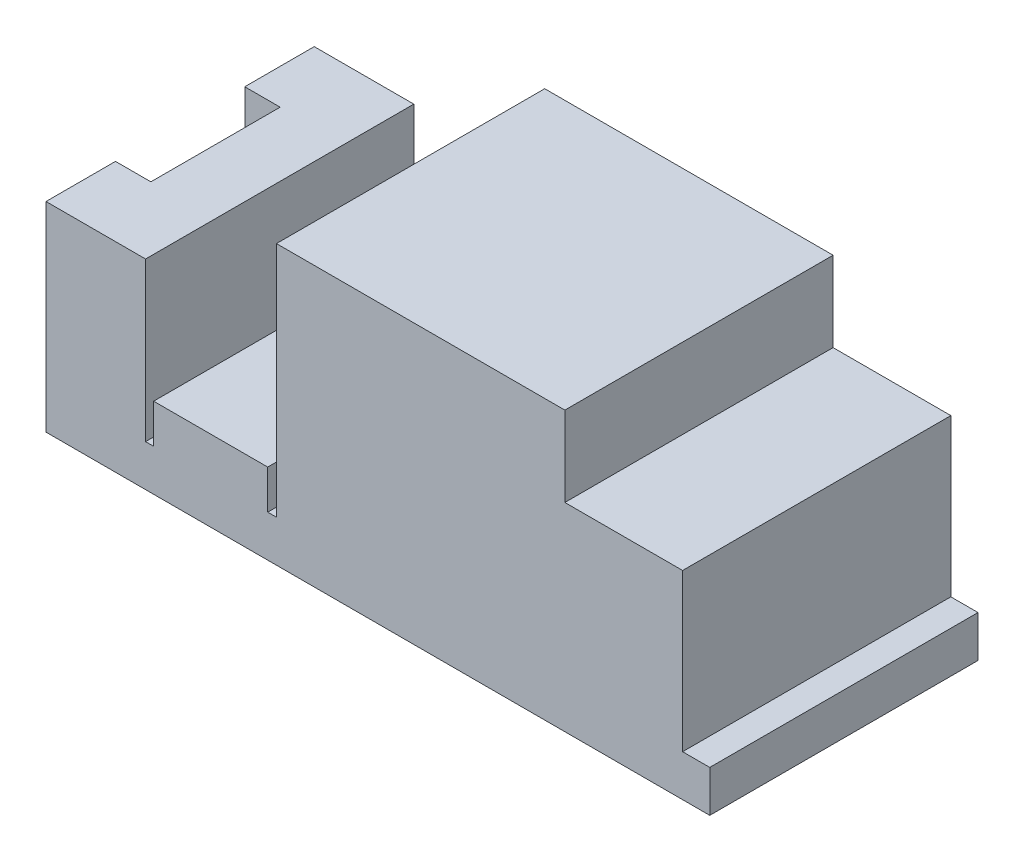
ISO-10303-21;
HEADER;
FILE_DESCRIPTION(('STEP AP214'),'2;1');
FILE_NAME('part.step','',(''),(''),'','','');
FILE_SCHEMA(('AUTOMOTIVE_DESIGN { 1 0 10303 214 1 1 1 1 }'));
ENDSEC;
DATA;
#1=APPLICATION_CONTEXT('core data for automotive mechanical design processes');
#2=APPLICATION_PROTOCOL_DEFINITION('international standard','automotive_design',2000,#1);
#3=PRODUCT_CONTEXT('',#1,'mechanical');
#4=PRODUCT('Part','Part','',(#3));
#5=PRODUCT_RELATED_PRODUCT_CATEGORY('part','',(#4));
#6=PRODUCT_DEFINITION_FORMATION('','',#4);
#7=PRODUCT_DEFINITION_CONTEXT('part definition',#1,'design');
#8=PRODUCT_DEFINITION('design','',#6,#7);
#9=PRODUCT_DEFINITION_SHAPE('','',#8);
#10=(LENGTH_UNIT() NAMED_UNIT(*) SI_UNIT(.MILLI.,.METRE.));
#11=(NAMED_UNIT(*) PLANE_ANGLE_UNIT() SI_UNIT($,.RADIAN.));
#12=(NAMED_UNIT(*) SI_UNIT($,.STERADIAN.) SOLID_ANGLE_UNIT());
#13=UNCERTAINTY_MEASURE_WITH_UNIT(LENGTH_MEASURE(1.E-05),#10,'distance_accuracy_value','');
#14=(GEOMETRIC_REPRESENTATION_CONTEXT(3) GLOBAL_UNCERTAINTY_ASSIGNED_CONTEXT((#13)) GLOBAL_UNIT_ASSIGNED_CONTEXT((#10,
#11,#12)) REPRESENTATION_CONTEXT('',''));
#15=CARTESIAN_POINT('',(0.,0.,0.));
#16=DIRECTION('',(0.,0.,1.));
#17=DIRECTION('',(1.,0.,0.));
#18=AXIS2_PLACEMENT_3D('',#15,#16,#17);
#19=CARTESIAN_POINT('',(0.,0.,0.));
#20=DIRECTION('',(0.,1.,0.));
#21=DIRECTION('',(0.,0.,1.));
#22=AXIS2_PLACEMENT_3D('',#19,#20,#21);
#23=PLANE('',#22);
#24=DIRECTION('',(1.,0.,0.));
#25=VECTOR('',#24,1.);
#26=CARTESIAN_POINT('',(-21.565,0.,8.715));
#27=LINE('',#26,#25);
#28=CARTESIAN_POINT('',(-15.095,0.,8.715));
#29=VERTEX_POINT('',#28);
#30=CARTESIAN_POINT('',(-14.5701718055896,0.,8.715));
#31=VERTEX_POINT('',#30);
#32=EDGE_CURVE('E336',#29,#31,#27,.T.);
#33=ORIENTED_EDGE('',*,*,#32,.T.);
#34=DIRECTION('',(0.,0.,1.));
#35=VECTOR('',#34,1.);
#36=CARTESIAN_POINT('',(-14.5701718055896,0.,-8.715));
#37=LINE('',#36,#35);
#38=CARTESIAN_POINT('',(-14.5701718055896,0.,-8.715));
#39=VERTEX_POINT('',#38);
#40=EDGE_CURVE('E228',#39,#31,#37,.T.);
#41=ORIENTED_EDGE('',*,*,#40,.F.);
#42=DIRECTION('',(-1.,0.,0.));
#43=VECTOR('',#42,1.);
#44=CARTESIAN_POINT('',(-21.565,0.,-8.715));
#45=LINE('',#44,#43);
#46=CARTESIAN_POINT('',(-15.095,0.,-8.715));
#47=VERTEX_POINT('',#46);
#48=EDGE_CURVE('E351',#39,#47,#45,.T.);
#49=ORIENTED_EDGE('',*,*,#48,.T.);
#50=DIRECTION('',(0.,0.,-1.));
#51=VECTOR('',#50,1.);
#52=CARTESIAN_POINT('',(-15.095,0.,-8.715));
#53=LINE('',#52,#51);
#54=EDGE_CURVE('E306',#29,#47,#53,.T.);
#55=ORIENTED_EDGE('',*,*,#54,.F.);
#56=EDGE_LOOP('',(#33,#41,#49,#55));
#57=FACE_BOUND('',#56,.T.);
#58=ADVANCED_FACE('F40',(#57),#23,.T.);
#59=CARTESIAN_POINT('',(-6.58978752544258,0.,-8.715));
#60=VERTEX_POINT('',#59);
#61=CARTESIAN_POINT('',(-7.15904635430355,0.,-8.715));
#62=VERTEX_POINT('',#61);
#63=EDGE_CURVE('E356',#60,#62,#45,.T.);
#64=ORIENTED_EDGE('',*,*,#63,.T.);
#65=DIRECTION('',(0.,0.,-1.));
#66=VECTOR('',#65,1.);
#67=CARTESIAN_POINT('',(-7.15904635430355,0.,-8.715));
#68=LINE('',#67,#66);
#69=CARTESIAN_POINT('',(-7.15904635430355,0.,8.715));
#70=VERTEX_POINT('',#69);
#71=EDGE_CURVE('E66',#70,#62,#68,.T.);
#72=ORIENTED_EDGE('',*,*,#71,.F.);
#73=CARTESIAN_POINT('',(-6.58978752544258,0.,8.715));
#74=VERTEX_POINT('',#73);
#75=EDGE_CURVE('E358',#70,#74,#27,.T.);
#76=ORIENTED_EDGE('',*,*,#75,.T.);
#77=DIRECTION('',(0.,0.,1.));
#78=VECTOR('',#77,1.);
#79=CARTESIAN_POINT('',(-6.58978752544258,0.,-8.715));
#80=LINE('',#79,#78);
#81=EDGE_CURVE('E249',#60,#74,#80,.T.);
#82=ORIENTED_EDGE('',*,*,#81,.F.);
#83=EDGE_LOOP('',(#64,#72,#76,#82));
#84=FACE_BOUND('',#83,.T.);
#85=ADVANCED_FACE('F450',(#84),#23,.T.);
#86=CARTESIAN_POINT('',(21.565,-2.7,-8.715));
#87=DIRECTION('',(1.,0.,0.));
#88=DIRECTION('',(0.,0.,-1.));
#89=AXIS2_PLACEMENT_3D('',#86,#87,#88);
#90=PLANE('',#89);
#91=DIRECTION('',(0.,0.,-1.));
#92=VECTOR('',#91,1.);
#93=CARTESIAN_POINT('',(21.565,0.,-8.715));
#94=LINE('',#93,#92);
#95=CARTESIAN_POINT('',(21.565,0.,8.715));
#96=VERTEX_POINT('',#95);
#97=CARTESIAN_POINT('',(21.565,0.,-8.715));
#98=VERTEX_POINT('',#97);
#99=EDGE_CURVE('E330',#96,#98,#94,.T.);
#100=ORIENTED_EDGE('',*,*,#99,.F.);
#101=DIRECTION('',(0.,1.,0.));
#102=VECTOR('',#101,1.);
#103=CARTESIAN_POINT('',(21.565,-2.7,8.715));
#104=LINE('',#103,#102);
#105=CARTESIAN_POINT('',(21.565,-2.7,8.715));
#106=VERTEX_POINT('',#105);
#107=EDGE_CURVE('E11',#106,#96,#104,.T.);
#108=ORIENTED_EDGE('',*,*,#107,.F.);
#109=DIRECTION('',(0.,0.,-1.));
#110=VECTOR('',#109,1.);
#111=CARTESIAN_POINT('',(21.565,-2.7,-8.715));
#112=LINE('',#111,#110);
#113=CARTESIAN_POINT('',(21.565,-2.7,-8.715));
#114=VERTEX_POINT('',#113);
#115=EDGE_CURVE('E331',#106,#114,#112,.T.);
#116=ORIENTED_EDGE('',*,*,#115,.T.);
#117=DIRECTION('',(0.,1.,0.));
#118=VECTOR('',#117,1.);
#119=CARTESIAN_POINT('',(21.565,-2.7,-8.715));
#120=LINE('',#119,#118);
#121=EDGE_CURVE('E44',#114,#98,#120,.T.);
#122=ORIENTED_EDGE('',*,*,#121,.T.);
#123=EDGE_LOOP('',(#100,#108,#116,#122));
#124=FACE_BOUND('',#123,.T.);
#125=ADVANCED_FACE('F42',(#124),#90,.T.);
#126=CARTESIAN_POINT('',(-21.565,-2.7,8.715));
#127=DIRECTION('',(0.,0.,1.));
#128=DIRECTION('',(1.,0.,0.));
#129=AXIS2_PLACEMENT_3D('',#126,#127,#128);
#130=PLANE('',#129);
#131=ORIENTED_EDGE('',*,*,#32,.F.);
#132=DIRECTION('',(0.,-1.,0.));
#133=VECTOR('',#132,1.);
#134=CARTESIAN_POINT('',(-15.095,10.28,8.715));
#135=LINE('',#134,#133);
#136=CARTESIAN_POINT('',(-15.095,10.28,8.715));
#137=VERTEX_POINT('',#136);
#138=EDGE_CURVE('E326',#137,#29,#135,.T.);
#139=ORIENTED_EDGE('',*,*,#138,.F.);
#140=DIRECTION('',(1.,0.,0.));
#141=VECTOR('',#140,1.);
#142=CARTESIAN_POINT('',(-21.565,10.28,8.715));
#143=LINE('',#142,#141);
#144=CARTESIAN_POINT('',(-21.565,10.28,8.715));
#145=VERTEX_POINT('',#144);
#146=EDGE_CURVE('E313',#145,#137,#143,.T.);
#147=ORIENTED_EDGE('',*,*,#146,.F.);
#148=DIRECTION('',(0.,1.,0.));
#149=VECTOR('',#148,1.);
#150=CARTESIAN_POINT('',(-21.565,-2.7,8.715));
#151=LINE('',#150,#149);
#152=CARTESIAN_POINT('',(-21.565,-2.7,8.715));
#153=VERTEX_POINT('',#152);
#154=EDGE_CURVE('E50',#153,#145,#151,.T.);
#155=ORIENTED_EDGE('',*,*,#154,.F.);
#156=DIRECTION('',(1.,0.,0.));
#157=VECTOR('',#156,1.);
#158=CARTESIAN_POINT('',(-21.565,-2.7,8.715));
#159=LINE('',#158,#157);
#160=EDGE_CURVE('E344',#153,#106,#159,.T.);
#161=ORIENTED_EDGE('',*,*,#160,.T.);
#162=ORIENTED_EDGE('',*,*,#107,.T.);
#163=CARTESIAN_POINT('',(19.8002124745574,0.,8.715));
#164=VERTEX_POINT('',#163);
#165=EDGE_CURVE('E355',#164,#96,#27,.T.);
#166=ORIENTED_EDGE('',*,*,#165,.F.);
#167=DIRECTION('',(0.,-1.,0.));
#168=VECTOR('',#167,1.);
#169=CARTESIAN_POINT('',(19.8002124745574,10.2,8.715));
#170=LINE('',#169,#168);
#171=CARTESIAN_POINT('',(19.8002124745574,10.2,8.715));
#172=VERTEX_POINT('',#171);
#173=EDGE_CURVE('E302',#172,#164,#170,.T.);
#174=ORIENTED_EDGE('',*,*,#173,.F.);
#175=DIRECTION('',(1.,0.,0.));
#176=VECTOR('',#175,1.);
#177=CARTESIAN_POINT('',(0.,10.2,8.715));
#178=LINE('',#177,#176);
#179=CARTESIAN_POINT('',(12.1502124745574,10.2,8.715));
#180=VERTEX_POINT('',#179);
#181=EDGE_CURVE('E289',#180,#172,#178,.T.);
#182=ORIENTED_EDGE('',*,*,#181,.F.);
#183=DIRECTION('',(0.,-1.,0.));
#184=VECTOR('',#183,1.);
#185=CARTESIAN_POINT('',(12.1502124745574,15.4,8.715));
#186=LINE('',#185,#184);
#187=CARTESIAN_POINT('',(12.1502124745574,15.4,8.715));
#188=VERTEX_POINT('',#187);
#189=EDGE_CURVE('E270',#188,#180,#186,.T.);
#190=ORIENTED_EDGE('',*,*,#189,.F.);
#191=DIRECTION('',(1.,0.,0.));
#192=VECTOR('',#191,1.);
#193=CARTESIAN_POINT('',(12.1502124745574,15.4,8.715));
#194=LINE('',#193,#192);
#195=CARTESIAN_POINT('',(-6.58978752544258,15.4,8.715));
#196=VERTEX_POINT('',#195);
#197=EDGE_CURVE('E257',#196,#188,#194,.T.);
#198=ORIENTED_EDGE('',*,*,#197,.F.);
#199=DIRECTION('',(0.,-1.,0.));
#200=VECTOR('',#199,1.);
#201=CARTESIAN_POINT('',(-6.58978752544258,15.4,8.715));
#202=LINE('',#201,#200);
#203=EDGE_CURVE('E273',#196,#74,#202,.T.);
#204=ORIENTED_EDGE('',*,*,#203,.T.);
#205=ORIENTED_EDGE('',*,*,#75,.F.);
#206=DIRECTION('',(0.,-1.,0.));
#207=VECTOR('',#206,1.);
#208=CARTESIAN_POINT('',(-7.15904635430355,2.54,8.715));
#209=LINE('',#208,#207);
#210=CARTESIAN_POINT('',(-7.15904635430355,2.54,8.715));
#211=VERTEX_POINT('',#210);
#212=EDGE_CURVE('E237',#211,#70,#209,.T.);
#213=ORIENTED_EDGE('',*,*,#212,.F.);
#214=DIRECTION('',(1.,0.,0.));
#215=VECTOR('',#214,1.);
#216=CARTESIAN_POINT('',(-14.5701718055896,2.54,8.715));
#217=LINE('',#216,#215);
#218=CARTESIAN_POINT('',(-14.5701718055896,2.54,8.715));
#219=VERTEX_POINT('',#218);
#220=EDGE_CURVE('E221',#219,#211,#217,.T.);
#221=ORIENTED_EDGE('',*,*,#220,.F.);
#222=DIRECTION('',(0.,-1.,0.));
#223=VECTOR('',#222,1.);
#224=CARTESIAN_POINT('',(-14.5701718055896,2.54,8.715));
#225=LINE('',#224,#223);
#226=EDGE_CURVE('E241',#219,#31,#225,.T.);
#227=ORIENTED_EDGE('',*,*,#226,.T.);
#228=EDGE_LOOP('',(#131,#139,#147,#155,#161,#162,#166,#174,#182,#190,#198,#204,#205,#213,#221,#227));
#229=FACE_BOUND('',#228,.T.);
#230=ADVANCED_FACE('F383',(#229),#130,.T.);
#231=CARTESIAN_POINT('',(-21.565,-2.7,-8.715));
#232=DIRECTION('',(-1.,0.,0.));
#233=DIRECTION('',(0.,0.,1.));
#234=AXIS2_PLACEMENT_3D('',#231,#232,#233);
#235=PLANE('',#234);
#236=DIRECTION('',(0.,1.,0.));
#237=VECTOR('',#236,1.);
#238=CARTESIAN_POINT('',(-21.565,0.,4.2));
#239=LINE('',#238,#237);
#240=CARTESIAN_POINT('',(-21.565,0.,4.2));
#241=VERTEX_POINT('',#240);
#242=CARTESIAN_POINT('',(-21.565,10.28,4.2));
#243=VERTEX_POINT('',#242);
#244=EDGE_CURVE('E431',#241,#243,#239,.T.);
#245=ORIENTED_EDGE('',*,*,#244,.F.);
#246=DIRECTION('',(0.,0.,1.));
#247=VECTOR('',#246,1.);
#248=CARTESIAN_POINT('',(-21.565,0.,-4.2));
#249=LINE('',#248,#247);
#250=CARTESIAN_POINT('',(-21.565,0.,-4.2));
#251=VERTEX_POINT('',#250);
#252=EDGE_CURVE('E426',#251,#241,#249,.T.);
#253=ORIENTED_EDGE('',*,*,#252,.F.);
#254=DIRECTION('',(0.,-1.,0.));
#255=VECTOR('',#254,1.);
#256=CARTESIAN_POINT('',(-21.565,0.,-4.2));
#257=LINE('',#256,#255);
#258=CARTESIAN_POINT('',(-21.565,10.28,-4.2));
#259=VERTEX_POINT('',#258);
#260=EDGE_CURVE('E394',#259,#251,#257,.T.);
#261=ORIENTED_EDGE('',*,*,#260,.F.);
#262=DIRECTION('',(0.,0.,1.));
#263=VECTOR('',#262,1.);
#264=CARTESIAN_POINT('',(-21.565,10.28,-8.715));
#265=LINE('',#264,#263);
#266=CARTESIAN_POINT('',(-21.565,10.28,-8.715));
#267=VERTEX_POINT('',#266);
#268=EDGE_CURVE('E203',#267,#259,#265,.T.);
#269=ORIENTED_EDGE('',*,*,#268,.F.);
#270=DIRECTION('',(0.,1.,0.));
#271=VECTOR('',#270,1.);
#272=CARTESIAN_POINT('',(-21.565,-2.7,-8.715));
#273=LINE('',#272,#271);
#274=CARTESIAN_POINT('',(-21.565,-2.7,-8.715));
#275=VERTEX_POINT('',#274);
#276=EDGE_CURVE('E362',#275,#267,#273,.T.);
#277=ORIENTED_EDGE('',*,*,#276,.F.);
#278=DIRECTION('',(0.,0.,1.));
#279=VECTOR('',#278,1.);
#280=CARTESIAN_POINT('',(-21.565,-2.7,-8.715));
#281=LINE('',#280,#279);
#282=EDGE_CURVE('E340',#275,#153,#281,.T.);
#283=ORIENTED_EDGE('',*,*,#282,.T.);
#284=ORIENTED_EDGE('',*,*,#154,.T.);
#285=EDGE_CURVE('E310',#243,#145,#265,.T.);
#286=ORIENTED_EDGE('',*,*,#285,.F.);
#287=EDGE_LOOP('',(#245,#253,#261,#269,#277,#283,#284,#286));
#288=FACE_BOUND('',#287,.T.);
#289=ADVANCED_FACE('F390',(#288),#235,.T.);
#290=CARTESIAN_POINT('',(-21.565,-2.7,-8.715));
#291=DIRECTION('',(0.,0.,-1.));
#292=DIRECTION('',(-1.,0.,0.));
#293=AXIS2_PLACEMENT_3D('',#290,#291,#292);
#294=PLANE('',#293);
#295=ORIENTED_EDGE('',*,*,#63,.F.);
#296=DIRECTION('',(0.,-1.,0.));
#297=VECTOR('',#296,1.);
#298=CARTESIAN_POINT('',(-6.58978752544258,15.4,-8.715));
#299=LINE('',#298,#297);
#300=CARTESIAN_POINT('',(-6.58978752544258,15.4,-8.715));
#301=VERTEX_POINT('',#300);
#302=EDGE_CURVE('E277',#301,#60,#299,.T.);
#303=ORIENTED_EDGE('',*,*,#302,.F.);
#304=DIRECTION('',(-1.,0.,0.));
#305=VECTOR('',#304,1.);
#306=CARTESIAN_POINT('',(12.1502124745574,15.4,-8.715));
#307=LINE('',#306,#305);
#308=CARTESIAN_POINT('',(12.1502124745574,15.4,-8.715));
#309=VERTEX_POINT('',#308);
#310=EDGE_CURVE('E250',#309,#301,#307,.T.);
#311=ORIENTED_EDGE('',*,*,#310,.F.);
#312=DIRECTION('',(0.,-1.,0.));
#313=VECTOR('',#312,1.);
#314=CARTESIAN_POINT('',(12.1502124745574,15.4,-8.715));
#315=LINE('',#314,#313);
#316=CARTESIAN_POINT('',(12.1502124745574,10.2,-8.715));
#317=VERTEX_POINT('',#316);
#318=EDGE_CURVE('E263',#309,#317,#315,.T.);
#319=ORIENTED_EDGE('',*,*,#318,.T.);
#320=DIRECTION('',(-1.,0.,0.));
#321=VECTOR('',#320,1.);
#322=CARTESIAN_POINT('',(0.,10.2,-8.715));
#323=LINE('',#322,#321);
#324=CARTESIAN_POINT('',(19.8002124745574,10.2,-8.715));
#325=VERTEX_POINT('',#324);
#326=EDGE_CURVE('E281',#325,#317,#323,.T.);
#327=ORIENTED_EDGE('',*,*,#326,.F.);
#328=DIRECTION('',(0.,-1.,0.));
#329=VECTOR('',#328,1.);
#330=CARTESIAN_POINT('',(19.8002124745574,10.2,-8.715));
#331=LINE('',#330,#329);
#332=CARTESIAN_POINT('',(19.8002124745574,0.,-8.715));
#333=VERTEX_POINT('',#332);
#334=EDGE_CURVE('E296',#325,#333,#331,.T.);
#335=ORIENTED_EDGE('',*,*,#334,.T.);
#336=EDGE_CURVE('E352',#98,#333,#45,.T.);
#337=ORIENTED_EDGE('',*,*,#336,.F.);
#338=ORIENTED_EDGE('',*,*,#121,.F.);
#339=DIRECTION('',(-1.,0.,0.));
#340=VECTOR('',#339,1.);
#341=CARTESIAN_POINT('',(-21.565,-2.7,-8.715));
#342=LINE('',#341,#340);
#343=EDGE_CURVE('E335',#114,#275,#342,.T.);
#344=ORIENTED_EDGE('',*,*,#343,.T.);
#345=ORIENTED_EDGE('',*,*,#276,.T.);
#346=DIRECTION('',(-1.,0.,0.));
#347=VECTOR('',#346,1.);
#348=CARTESIAN_POINT('',(-21.565,10.28,-8.715));
#349=LINE('',#348,#347);
#350=CARTESIAN_POINT('',(-15.095,10.28,-8.715));
#351=VERTEX_POINT('',#350);
#352=EDGE_CURVE('E307',#351,#267,#349,.T.);
#353=ORIENTED_EDGE('',*,*,#352,.F.);
#354=DIRECTION('',(0.,-1.,0.));
#355=VECTOR('',#354,1.);
#356=CARTESIAN_POINT('',(-15.095,10.28,-8.715));
#357=LINE('',#356,#355);
#358=EDGE_CURVE('E319',#351,#47,#357,.T.);
#359=ORIENTED_EDGE('',*,*,#358,.T.);
#360=ORIENTED_EDGE('',*,*,#48,.F.);
#361=DIRECTION('',(0.,-1.,0.));
#362=VECTOR('',#361,1.);
#363=CARTESIAN_POINT('',(-14.5701718055896,2.54,-8.715));
#364=LINE('',#363,#362);
#365=CARTESIAN_POINT('',(-14.5701718055896,2.54,-8.715));
#366=VERTEX_POINT('',#365);
#367=EDGE_CURVE('E245',#366,#39,#364,.T.);
#368=ORIENTED_EDGE('',*,*,#367,.F.);
#369=DIRECTION('',(-1.,0.,0.));
#370=VECTOR('',#369,1.);
#371=CARTESIAN_POINT('',(-14.5701718055896,2.54,-8.715));
#372=LINE('',#371,#370);
#373=CARTESIAN_POINT('',(-7.15904635430355,2.54,-8.715));
#374=VERTEX_POINT('',#373);
#375=EDGE_CURVE('E214',#374,#366,#372,.T.);
#376=ORIENTED_EDGE('',*,*,#375,.F.);
#377=DIRECTION('',(0.,-1.,0.));
#378=VECTOR('',#377,1.);
#379=CARTESIAN_POINT('',(-7.15904635430355,2.54,-8.715));
#380=LINE('',#379,#378);
#381=EDGE_CURVE('E227',#374,#62,#380,.T.);
#382=ORIENTED_EDGE('',*,*,#381,.T.);
#383=EDGE_LOOP('',(#295,#303,#311,#319,#327,#335,#337,#338,#344,#345,#353,#359,#360,#368,#376,#382));
#384=FACE_BOUND('',#383,.T.);
#385=ADVANCED_FACE('F373',(#384),#294,.T.);
#386=CARTESIAN_POINT('',(0.,-2.7,0.));
#387=DIRECTION('',(0.,1.,0.));
#388=DIRECTION('',(0.,0.,1.));
#389=AXIS2_PLACEMENT_3D('',#386,#387,#388);
#390=PLANE('',#389);
#391=ORIENTED_EDGE('',*,*,#115,.F.);
#392=ORIENTED_EDGE('',*,*,#160,.F.);
#393=ORIENTED_EDGE('',*,*,#282,.F.);
#394=ORIENTED_EDGE('',*,*,#343,.F.);
#395=EDGE_LOOP('',(#391,#392,#393,#394));
#396=FACE_BOUND('',#395,.T.);
#397=ADVANCED_FACE('F386',(#396),#390,.F.);
#398=DIRECTION('',(0.,0.,1.));
#399=VECTOR('',#398,1.);
#400=CARTESIAN_POINT('',(19.8002124745574,0.,0.));
#401=LINE('',#400,#399);
#402=EDGE_CURVE('E280',#333,#164,#401,.T.);
#403=ORIENTED_EDGE('',*,*,#402,.T.);
#404=ORIENTED_EDGE('',*,*,#165,.T.);
#405=ORIENTED_EDGE('',*,*,#99,.T.);
#406=ORIENTED_EDGE('',*,*,#336,.T.);
#407=EDGE_LOOP('',(#403,#404,#405,#406));
#408=FACE_BOUND('',#407,.T.);
#409=ADVANCED_FACE('F377',(#408),#23,.T.);
#410=CARTESIAN_POINT('',(-15.095,10.28,-8.715));
#411=DIRECTION('',(-1.,0.,0.));
#412=DIRECTION('',(0.,0.,1.));
#413=AXIS2_PLACEMENT_3D('',#410,#411,#412);
#414=PLANE('',#413);
#415=ORIENTED_EDGE('',*,*,#54,.T.);
#416=ORIENTED_EDGE('',*,*,#358,.F.);
#417=DIRECTION('',(0.,0.,-1.));
#418=VECTOR('',#417,1.);
#419=CARTESIAN_POINT('',(-15.095,10.28,-8.715));
#420=LINE('',#419,#418);
#421=EDGE_CURVE('E316',#137,#351,#420,.T.);
#422=ORIENTED_EDGE('',*,*,#421,.F.);
#423=ORIENTED_EDGE('',*,*,#138,.T.);
#424=EDGE_LOOP('',(#415,#416,#422,#423));
#425=FACE_BOUND('',#424,.T.);
#426=ADVANCED_FACE('F400',(#425),#414,.F.);
#427=CARTESIAN_POINT('',(0.,10.28,0.));
#428=DIRECTION('',(0.,-1.,0.));
#429=DIRECTION('',(0.,0.,-1.));
#430=AXIS2_PLACEMENT_3D('',#427,#428,#429);
#431=PLANE('',#430);
#432=DIRECTION('',(0.,0.,-1.));
#433=VECTOR('',#432,1.);
#434=CARTESIAN_POINT('',(-19.265,10.28,-4.2));
#435=LINE('',#434,#433);
#436=CARTESIAN_POINT('',(-19.265,10.28,4.2));
#437=VERTEX_POINT('',#436);
#438=CARTESIAN_POINT('',(-19.265,10.28,-4.2));
#439=VERTEX_POINT('',#438);
#440=EDGE_CURVE('E191',#437,#439,#435,.T.);
#441=ORIENTED_EDGE('',*,*,#440,.F.);
#442=DIRECTION('',(-1.,0.,0.));
#443=VECTOR('',#442,1.);
#444=CARTESIAN_POINT('',(-19.265,10.28,4.2));
#445=LINE('',#444,#443);
#446=EDGE_CURVE('E205',#437,#243,#445,.T.);
#447=ORIENTED_EDGE('',*,*,#446,.T.);
#448=ORIENTED_EDGE('',*,*,#285,.T.);
#449=ORIENTED_EDGE('',*,*,#146,.T.);
#450=ORIENTED_EDGE('',*,*,#421,.T.);
#451=ORIENTED_EDGE('',*,*,#352,.T.);
#452=ORIENTED_EDGE('',*,*,#268,.T.);
#453=DIRECTION('',(-1.,0.,0.));
#454=VECTOR('',#453,1.);
#455=CARTESIAN_POINT('',(-19.265,10.28,-4.2));
#456=LINE('',#455,#454);
#457=EDGE_CURVE('E185',#439,#259,#456,.T.);
#458=ORIENTED_EDGE('',*,*,#457,.F.);
#459=EDGE_LOOP('',(#441,#447,#448,#449,#450,#451,#452,#458));
#460=FACE_BOUND('',#459,.T.);
#461=ADVANCED_FACE('F200',(#460),#431,.F.);
#462=CARTESIAN_POINT('',(19.8002124745574,10.2,0.));
#463=DIRECTION('',(1.,0.,0.));
#464=DIRECTION('',(0.,0.,-1.));
#465=AXIS2_PLACEMENT_3D('',#462,#463,#464);
#466=PLANE('',#465);
#467=ORIENTED_EDGE('',*,*,#402,.F.);
#468=ORIENTED_EDGE('',*,*,#334,.F.);
#469=DIRECTION('',(0.,0.,1.));
#470=VECTOR('',#469,1.);
#471=CARTESIAN_POINT('',(19.8002124745574,10.2,0.));
#472=LINE('',#471,#470);
#473=EDGE_CURVE('E292',#325,#172,#472,.T.);
#474=ORIENTED_EDGE('',*,*,#473,.T.);
#475=ORIENTED_EDGE('',*,*,#173,.T.);
#476=EDGE_LOOP('',(#467,#468,#474,#475));
#477=FACE_BOUND('',#476,.T.);
#478=ADVANCED_FACE('F469',(#477),#466,.T.);
#479=CARTESIAN_POINT('',(0.,10.2,0.));
#480=DIRECTION('',(0.,1.,0.));
#481=DIRECTION('',(0.,0.,1.));
#482=AXIS2_PLACEMENT_3D('',#479,#480,#481);
#483=PLANE('',#482);
#484=ORIENTED_EDGE('',*,*,#326,.T.);
#485=DIRECTION('',(0.,0.,1.));
#486=VECTOR('',#485,1.);
#487=CARTESIAN_POINT('',(12.1502124745574,10.2,0.));
#488=LINE('',#487,#486);
#489=EDGE_CURVE('E285',#317,#180,#488,.T.);
#490=ORIENTED_EDGE('',*,*,#489,.T.);
#491=ORIENTED_EDGE('',*,*,#181,.T.);
#492=ORIENTED_EDGE('',*,*,#473,.F.);
#493=EDGE_LOOP('',(#484,#490,#491,#492));
#494=FACE_BOUND('',#493,.T.);
#495=ADVANCED_FACE('F472',(#494),#483,.T.);
#496=CARTESIAN_POINT('',(-6.58978752544258,15.4,-8.715));
#497=DIRECTION('',(1.,0.,0.));
#498=DIRECTION('',(0.,0.,-1.));
#499=AXIS2_PLACEMENT_3D('',#496,#497,#498);
#500=PLANE('',#499);
#501=ORIENTED_EDGE('',*,*,#81,.T.);
#502=ORIENTED_EDGE('',*,*,#203,.F.);
#503=DIRECTION('',(0.,0.,1.));
#504=VECTOR('',#503,1.);
#505=CARTESIAN_POINT('',(-6.58978752544258,15.4,-8.715));
#506=LINE('',#505,#504);
#507=EDGE_CURVE('E254',#301,#196,#506,.T.);
#508=ORIENTED_EDGE('',*,*,#507,.F.);
#509=ORIENTED_EDGE('',*,*,#302,.T.);
#510=EDGE_LOOP('',(#501,#502,#508,#509));
#511=FACE_BOUND('',#510,.T.);
#512=ADVANCED_FACE('F476',(#511),#500,.F.);
#513=CARTESIAN_POINT('',(12.1502124745574,15.4,-8.715));
#514=DIRECTION('',(-1.,0.,0.));
#515=DIRECTION('',(0.,0.,1.));
#516=AXIS2_PLACEMENT_3D('',#513,#514,#515);
#517=PLANE('',#516);
#518=ORIENTED_EDGE('',*,*,#489,.F.);
#519=ORIENTED_EDGE('',*,*,#318,.F.);
#520=DIRECTION('',(0.,0.,-1.));
#521=VECTOR('',#520,1.);
#522=CARTESIAN_POINT('',(12.1502124745574,15.4,-8.715));
#523=LINE('',#522,#521);
#524=EDGE_CURVE('E260',#188,#309,#523,.T.);
#525=ORIENTED_EDGE('',*,*,#524,.F.);
#526=ORIENTED_EDGE('',*,*,#189,.T.);
#527=EDGE_LOOP('',(#518,#519,#525,#526));
#528=FACE_BOUND('',#527,.T.);
#529=ADVANCED_FACE('F480',(#528),#517,.F.);
#530=CARTESIAN_POINT('',(0.,15.4,0.));
#531=DIRECTION('',(0.,1.,0.));
#532=DIRECTION('',(0.,0.,1.));
#533=AXIS2_PLACEMENT_3D('',#530,#531,#532);
#534=PLANE('',#533);
#535=ORIENTED_EDGE('',*,*,#310,.T.);
#536=ORIENTED_EDGE('',*,*,#507,.T.);
#537=ORIENTED_EDGE('',*,*,#197,.T.);
#538=ORIENTED_EDGE('',*,*,#524,.T.);
#539=EDGE_LOOP('',(#535,#536,#537,#538));
#540=FACE_BOUND('',#539,.T.);
#541=ADVANCED_FACE('F484',(#540),#534,.T.);
#542=CARTESIAN_POINT('',(-14.5701718055896,2.54,-8.715));
#543=DIRECTION('',(1.,0.,0.));
#544=DIRECTION('',(0.,0.,-1.));
#545=AXIS2_PLACEMENT_3D('',#542,#543,#544);
#546=PLANE('',#545);
#547=ORIENTED_EDGE('',*,*,#40,.T.);
#548=ORIENTED_EDGE('',*,*,#226,.F.);
#549=DIRECTION('',(0.,0.,1.));
#550=VECTOR('',#549,1.);
#551=CARTESIAN_POINT('',(-14.5701718055896,2.54,-8.715));
#552=LINE('',#551,#550);
#553=EDGE_CURVE('E218',#366,#219,#552,.T.);
#554=ORIENTED_EDGE('',*,*,#553,.F.);
#555=ORIENTED_EDGE('',*,*,#367,.T.);
#556=EDGE_LOOP('',(#547,#548,#554,#555));
#557=FACE_BOUND('',#556,.T.);
#558=ADVANCED_FACE('F407',(#557),#546,.F.);
#559=CARTESIAN_POINT('',(-7.15904635430355,2.54,-8.715));
#560=DIRECTION('',(-1.,0.,0.));
#561=DIRECTION('',(0.,0.,1.));
#562=AXIS2_PLACEMENT_3D('',#559,#560,#561);
#563=PLANE('',#562);
#564=ORIENTED_EDGE('',*,*,#71,.T.);
#565=ORIENTED_EDGE('',*,*,#381,.F.);
#566=DIRECTION('',(0.,0.,-1.));
#567=VECTOR('',#566,1.);
#568=CARTESIAN_POINT('',(-7.15904635430355,2.54,-8.715));
#569=LINE('',#568,#567);
#570=EDGE_CURVE('E224',#211,#374,#569,.T.);
#571=ORIENTED_EDGE('',*,*,#570,.F.);
#572=ORIENTED_EDGE('',*,*,#212,.T.);
#573=EDGE_LOOP('',(#564,#565,#571,#572));
#574=FACE_BOUND('',#573,.T.);
#575=ADVANCED_FACE('F414',(#574),#563,.F.);
#576=CARTESIAN_POINT('',(0.,2.54,0.));
#577=DIRECTION('',(0.,-1.,0.));
#578=DIRECTION('',(0.,0.,-1.));
#579=AXIS2_PLACEMENT_3D('',#576,#577,#578);
#580=PLANE('',#579);
#581=ORIENTED_EDGE('',*,*,#375,.T.);
#582=ORIENTED_EDGE('',*,*,#553,.T.);
#583=ORIENTED_EDGE('',*,*,#220,.T.);
#584=ORIENTED_EDGE('',*,*,#570,.T.);
#585=EDGE_LOOP('',(#581,#582,#583,#584));
#586=FACE_BOUND('',#585,.T.);
#587=ADVANCED_FACE('F411',(#586),#580,.F.);
#588=CARTESIAN_POINT('',(-19.265,0.,4.2));
#589=DIRECTION('',(0.,0.,1.));
#590=DIRECTION('',(1.,0.,0.));
#591=AXIS2_PLACEMENT_3D('',#588,#589,#590);
#592=PLANE('',#591);
#593=ORIENTED_EDGE('',*,*,#244,.T.);
#594=ORIENTED_EDGE('',*,*,#446,.F.);
#595=DIRECTION('',(0.,1.,0.));
#596=VECTOR('',#595,1.);
#597=CARTESIAN_POINT('',(-19.265,0.,4.2));
#598=LINE('',#597,#596);
#599=CARTESIAN_POINT('',(-19.265,0.,4.2));
#600=VERTEX_POINT('',#599);
#601=EDGE_CURVE('E58',#600,#437,#598,.T.);
#602=ORIENTED_EDGE('',*,*,#601,.F.);
#603=DIRECTION('',(-1.,0.,0.));
#604=VECTOR('',#603,1.);
#605=CARTESIAN_POINT('',(-19.265,0.,4.2));
#606=LINE('',#605,#604);
#607=EDGE_CURVE('E209',#600,#241,#606,.T.);
#608=ORIENTED_EDGE('',*,*,#607,.T.);
#609=EDGE_LOOP('',(#593,#594,#602,#608));
#610=FACE_BOUND('',#609,.T.);
#611=ADVANCED_FACE('F439',(#610),#592,.F.);
#612=CARTESIAN_POINT('',(-19.265,0.,-4.2));
#613=DIRECTION('',(0.,-1.,0.));
#614=DIRECTION('',(0.,0.,-1.));
#615=AXIS2_PLACEMENT_3D('',#612,#613,#614);
#616=PLANE('',#615);
#617=ORIENTED_EDGE('',*,*,#252,.T.);
#618=ORIENTED_EDGE('',*,*,#607,.F.);
#619=DIRECTION('',(0.,0.,1.));
#620=VECTOR('',#619,1.);
#621=CARTESIAN_POINT('',(-19.265,0.,-4.2));
#622=LINE('',#621,#620);
#623=CARTESIAN_POINT('',(-19.265,0.,-4.2));
#624=VERTEX_POINT('',#623);
#625=EDGE_CURVE('E190',#624,#600,#622,.T.);
#626=ORIENTED_EDGE('',*,*,#625,.F.);
#627=DIRECTION('',(-1.,0.,0.));
#628=VECTOR('',#627,1.);
#629=CARTESIAN_POINT('',(-19.265,0.,-4.2));
#630=LINE('',#629,#628);
#631=EDGE_CURVE('E187',#624,#251,#630,.T.);
#632=ORIENTED_EDGE('',*,*,#631,.T.);
#633=EDGE_LOOP('',(#617,#618,#626,#632));
#634=FACE_BOUND('',#633,.T.);
#635=ADVANCED_FACE('F438',(#634),#616,.F.);
#636=CARTESIAN_POINT('',(-19.265,0.,-4.2));
#637=DIRECTION('',(0.,0.,-1.));
#638=DIRECTION('',(-1.,0.,0.));
#639=AXIS2_PLACEMENT_3D('',#636,#637,#638);
#640=PLANE('',#639);
#641=ORIENTED_EDGE('',*,*,#260,.T.);
#642=ORIENTED_EDGE('',*,*,#631,.F.);
#643=DIRECTION('',(0.,-1.,0.));
#644=VECTOR('',#643,1.);
#645=CARTESIAN_POINT('',(-19.265,0.,-4.2));
#646=LINE('',#645,#644);
#647=EDGE_CURVE('E181',#439,#624,#646,.T.);
#648=ORIENTED_EDGE('',*,*,#647,.F.);
#649=ORIENTED_EDGE('',*,*,#457,.T.);
#650=EDGE_LOOP('',(#641,#642,#648,#649));
#651=FACE_BOUND('',#650,.T.);
#652=ADVANCED_FACE('F183',(#651),#640,.F.);
#653=CARTESIAN_POINT('',(-19.265,0.,0.));
#654=DIRECTION('',(1.,0.,0.));
#655=DIRECTION('',(0.,0.,-1.));
#656=AXIS2_PLACEMENT_3D('',#653,#654,#655);
#657=PLANE('',#656);
#658=ORIENTED_EDGE('',*,*,#601,.T.);
#659=ORIENTED_EDGE('',*,*,#440,.T.);
#660=ORIENTED_EDGE('',*,*,#647,.T.);
#661=ORIENTED_EDGE('',*,*,#625,.T.);
#662=EDGE_LOOP('',(#658,#659,#660,#661));
#663=FACE_BOUND('',#662,.T.);
#664=ADVANCED_FACE('F194',(#663),#657,.F.);
#665=CLOSED_SHELL('',(#58,#85,#125,#230,#289,#385,#397,#409,#426,#461,#478,#495,#512,#529,#541,
#558,#575,#587,#611,#635,#652,#664));
#666=MANIFOLD_SOLID_BREP('B2',#665);
#667=ADVANCED_BREP_SHAPE_REPRESENTATION('',(#18,#666),#14);
#668=SHAPE_DEFINITION_REPRESENTATION(#9,#667);
ENDSEC;
END-ISO-10303-21;
